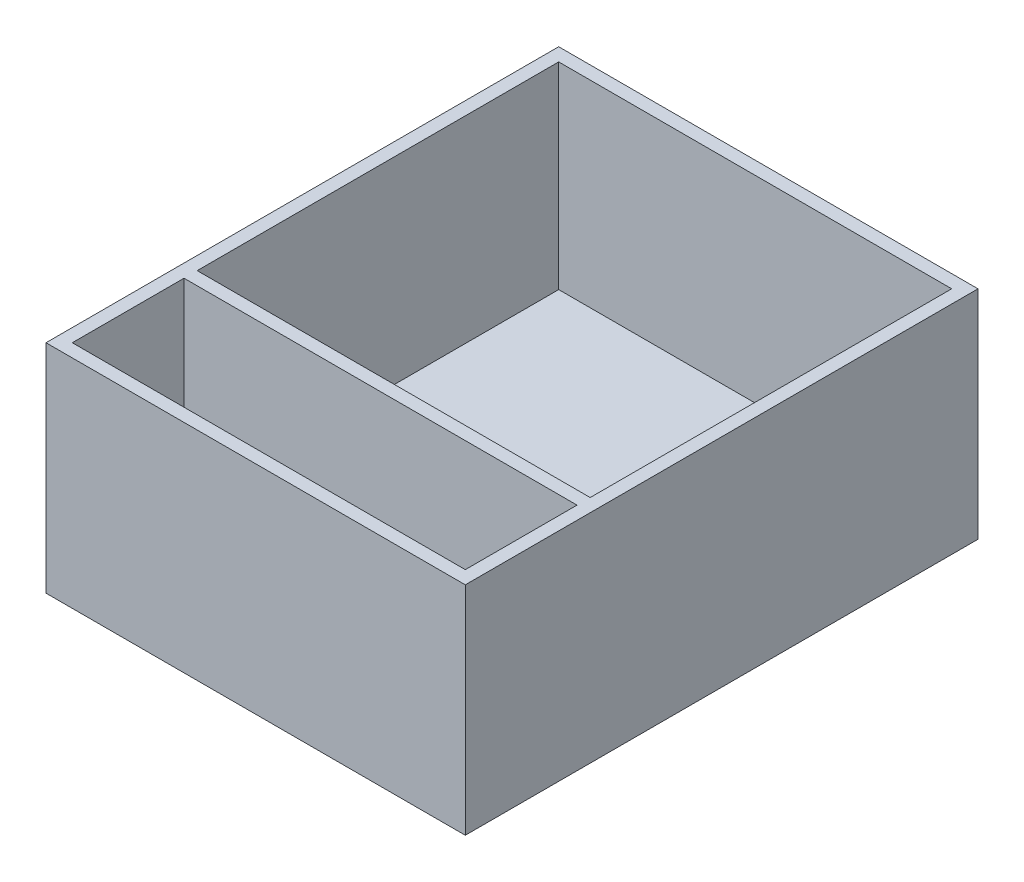
ISO-10303-21;
HEADER;
FILE_DESCRIPTION(('STEP AP214'),'2;1');
FILE_NAME('part.step','',(''),(''),'','','');
FILE_SCHEMA(('AUTOMOTIVE_DESIGN { 1 0 10303 214 1 1 1 1 }'));
ENDSEC;
DATA;
#1=APPLICATION_CONTEXT('core data for automotive mechanical design processes');
#2=APPLICATION_PROTOCOL_DEFINITION('international standard','automotive_design',2000,#1);
#3=PRODUCT_CONTEXT('',#1,'mechanical');
#4=PRODUCT('Part','Part','',(#3));
#5=PRODUCT_RELATED_PRODUCT_CATEGORY('part','',(#4));
#6=PRODUCT_DEFINITION_FORMATION('','',#4);
#7=PRODUCT_DEFINITION_CONTEXT('part definition',#1,'design');
#8=PRODUCT_DEFINITION('design','',#6,#7);
#9=PRODUCT_DEFINITION_SHAPE('','',#8);
#10=(LENGTH_UNIT() NAMED_UNIT(*) SI_UNIT(.MILLI.,.METRE.));
#11=(NAMED_UNIT(*) PLANE_ANGLE_UNIT() SI_UNIT($,.RADIAN.));
#12=(NAMED_UNIT(*) SI_UNIT($,.STERADIAN.) SOLID_ANGLE_UNIT());
#13=UNCERTAINTY_MEASURE_WITH_UNIT(LENGTH_MEASURE(1.E-05),#10,'distance_accuracy_value','');
#14=(GEOMETRIC_REPRESENTATION_CONTEXT(3) GLOBAL_UNCERTAINTY_ASSIGNED_CONTEXT((#13)) GLOBAL_UNIT_ASSIGNED_CONTEXT((#10,
#11,#12)) REPRESENTATION_CONTEXT('',''));
#15=CARTESIAN_POINT('',(0.,0.,0.));
#16=DIRECTION('',(0.,0.,1.));
#17=DIRECTION('',(1.,0.,0.));
#18=AXIS2_PLACEMENT_3D('',#15,#16,#17);
#19=CARTESIAN_POINT('',(0.,30.,52.7301638186687));
#20=DIRECTION('',(0.,0.,-1.));
#21=DIRECTION('',(-1.,0.,0.));
#22=AXIS2_PLACEMENT_3D('',#19,#20,#21);
#23=PLANE('',#22);
#24=DIRECTION('',(1.,0.,0.));
#25=VECTOR('',#24,1.);
#26=CARTESIAN_POINT('',(0.,0.,52.7301638186687));
#27=LINE('',#26,#25);
#28=CARTESIAN_POINT('',(-27.2157373250462,0.,52.7301638186687));
#29=VERTEX_POINT('',#28);
#30=CARTESIAN_POINT('',(32.5742626749538,0.,52.7301638186687));
#31=VERTEX_POINT('',#30);
#32=EDGE_CURVE('E150',#29,#31,#27,.T.);
#33=ORIENTED_EDGE('',*,*,#32,.T.);
#34=DIRECTION('',(0.,-1.,0.));
#35=VECTOR('',#34,1.);
#36=CARTESIAN_POINT('',(32.5742626749538,30.,52.7301638186687));
#37=LINE('',#36,#35);
#38=CARTESIAN_POINT('',(32.5742626749538,30.,52.7301638186687));
#39=VERTEX_POINT('',#38);
#40=EDGE_CURVE('E11',#39,#31,#37,.T.);
#41=ORIENTED_EDGE('',*,*,#40,.F.);
#42=DIRECTION('',(1.,0.,0.));
#43=VECTOR('',#42,1.);
#44=CARTESIAN_POINT('',(0.,30.,52.7301638186687));
#45=LINE('',#44,#43);
#46=CARTESIAN_POINT('',(-27.2157373250462,30.,52.7301638186687));
#47=VERTEX_POINT('',#46);
#48=EDGE_CURVE('E120',#47,#39,#45,.T.);
#49=ORIENTED_EDGE('',*,*,#48,.F.);
#50=DIRECTION('',(0.,-1.,0.));
#51=VECTOR('',#50,1.);
#52=CARTESIAN_POINT('',(-27.2157373250462,30.,52.7301638186687));
#53=LINE('',#52,#51);
#54=EDGE_CURVE('E52',#47,#29,#53,.T.);
#55=ORIENTED_EDGE('',*,*,#54,.T.);
#56=EDGE_LOOP('',(#33,#41,#49,#55));
#57=FACE_BOUND('',#56,.T.);
#58=ADVANCED_FACE('F33',(#57),#23,.F.);
#59=CARTESIAN_POINT('',(32.5742626749538,30.,0.));
#60=DIRECTION('',(1.,0.,0.));
#61=DIRECTION('',(0.,0.,-1.));
#62=AXIS2_PLACEMENT_3D('',#59,#60,#61);
#63=PLANE('',#62);
#64=DIRECTION('',(0.,0.,1.));
#65=VECTOR('',#64,1.);
#66=CARTESIAN_POINT('',(32.5742626749538,0.,0.));
#67=LINE('',#66,#65);
#68=CARTESIAN_POINT('',(32.5742626749538,0.,69.7301638186687));
#69=VERTEX_POINT('',#68);
#70=EDGE_CURVE('E126',#31,#69,#67,.T.);
#71=ORIENTED_EDGE('',*,*,#70,.T.);
#72=DIRECTION('',(0.,-1.,0.));
#73=VECTOR('',#72,1.);
#74=CARTESIAN_POINT('',(32.5742626749538,30.,69.7301638186687));
#75=LINE('',#74,#73);
#76=CARTESIAN_POINT('',(32.5742626749538,30.,69.7301638186687));
#77=VERTEX_POINT('',#76);
#78=EDGE_CURVE('E43',#77,#69,#75,.T.);
#79=ORIENTED_EDGE('',*,*,#78,.F.);
#80=DIRECTION('',(0.,0.,1.));
#81=VECTOR('',#80,1.);
#82=CARTESIAN_POINT('',(32.5742626749538,30.,0.));
#83=LINE('',#82,#81);
#84=EDGE_CURVE('E116',#39,#77,#83,.T.);
#85=ORIENTED_EDGE('',*,*,#84,.F.);
#86=ORIENTED_EDGE('',*,*,#40,.T.);
#87=EDGE_LOOP('',(#71,#79,#85,#86));
#88=FACE_BOUND('',#87,.T.);
#89=ADVANCED_FACE('F124',(#88),#63,.F.);
#90=CARTESIAN_POINT('',(0.,30.,69.7301638186687));
#91=DIRECTION('',(0.,0.,-1.));
#92=DIRECTION('',(-1.,0.,0.));
#93=AXIS2_PLACEMENT_3D('',#90,#91,#92);
#94=PLANE('',#93);
#95=DIRECTION('',(1.,0.,0.));
#96=VECTOR('',#95,1.);
#97=CARTESIAN_POINT('',(0.,0.,69.7301638186687));
#98=LINE('',#97,#96);
#99=CARTESIAN_POINT('',(-27.2157373250462,0.,69.7301638186687));
#100=VERTEX_POINT('',#99);
#101=EDGE_CURVE('E153',#100,#69,#98,.T.);
#102=ORIENTED_EDGE('',*,*,#101,.F.);
#103=DIRECTION('',(0.,-1.,0.));
#104=VECTOR('',#103,1.);
#105=CARTESIAN_POINT('',(-27.2157373250462,30.,69.7301638186687));
#106=LINE('',#105,#104);
#107=CARTESIAN_POINT('',(-27.2157373250462,30.,69.7301638186687));
#108=VERTEX_POINT('',#107);
#109=EDGE_CURVE('E128',#108,#100,#106,.T.);
#110=ORIENTED_EDGE('',*,*,#109,.F.);
#111=DIRECTION('',(1.,0.,0.));
#112=VECTOR('',#111,1.);
#113=CARTESIAN_POINT('',(0.,30.,69.7301638186687));
#114=LINE('',#113,#112);
#115=EDGE_CURVE('E119',#108,#77,#114,.T.);
#116=ORIENTED_EDGE('',*,*,#115,.T.);
#117=ORIENTED_EDGE('',*,*,#78,.T.);
#118=EDGE_LOOP('',(#102,#110,#116,#117));
#119=FACE_BOUND('',#118,.T.);
#120=ADVANCED_FACE('F130',(#119),#94,.T.);
#121=CARTESIAN_POINT('',(34.5742626749538,30.,0.));
#122=DIRECTION('',(1.,0.,0.));
#123=DIRECTION('',(0.,0.,-1.));
#124=AXIS2_PLACEMENT_3D('',#121,#122,#123);
#125=PLANE('',#124);
#126=DIRECTION('',(0.,-1.,0.));
#127=VECTOR('',#126,1.);
#128=CARTESIAN_POINT('',(34.5742626749538,30.,71.7301638186687));
#129=LINE('',#128,#127);
#130=CARTESIAN_POINT('',(34.5742626749538,30.,71.7301638186687));
#131=VERTEX_POINT('',#130);
#132=CARTESIAN_POINT('',(34.5742626749538,-3.,71.7301638186687));
#133=VERTEX_POINT('',#132);
#134=EDGE_CURVE('E162',#131,#133,#129,.T.);
#135=ORIENTED_EDGE('',*,*,#134,.T.);
#136=DIRECTION('',(0.,0.,1.));
#137=VECTOR('',#136,1.);
#138=CARTESIAN_POINT('',(34.5742626749538,-3.,-6.26983618133135));
#139=LINE('',#138,#137);
#140=CARTESIAN_POINT('',(34.5742626749538,-3.,-6.26983618133135));
#141=VERTEX_POINT('',#140);
#142=EDGE_CURVE('E230',#141,#133,#139,.T.);
#143=ORIENTED_EDGE('',*,*,#142,.F.);
#144=DIRECTION('',(0.,-1.,0.));
#145=VECTOR('',#144,1.);
#146=CARTESIAN_POINT('',(34.5742626749538,30.,-6.26983618133135));
#147=LINE('',#146,#145);
#148=CARTESIAN_POINT('',(34.5742626749538,30.,-6.26983618133135));
#149=VERTEX_POINT('',#148);
#150=EDGE_CURVE('E160',#149,#141,#147,.T.);
#151=ORIENTED_EDGE('',*,*,#150,.F.);
#152=DIRECTION('',(0.,0.,1.));
#153=VECTOR('',#152,1.);
#154=CARTESIAN_POINT('',(34.5742626749538,30.,0.));
#155=LINE('',#154,#153);
#156=EDGE_CURVE('E199',#149,#131,#155,.T.);
#157=ORIENTED_EDGE('',*,*,#156,.T.);
#158=EDGE_LOOP('',(#135,#143,#151,#157));
#159=FACE_BOUND('',#158,.T.);
#160=ADVANCED_FACE('F228',(#159),#125,.T.);
#161=CARTESIAN_POINT('',(0.,30.,-6.26983618133135));
#162=DIRECTION('',(0.,0.,-1.));
#163=DIRECTION('',(-1.,0.,0.));
#164=AXIS2_PLACEMENT_3D('',#161,#162,#163);
#165=PLANE('',#164);
#166=ORIENTED_EDGE('',*,*,#150,.T.);
#167=DIRECTION('',(1.,0.,0.));
#168=VECTOR('',#167,1.);
#169=CARTESIAN_POINT('',(-29.2157373250462,-3.,-6.26983618133135));
#170=LINE('',#169,#168);
#171=CARTESIAN_POINT('',(-29.2157373250462,-3.,-6.26983618133135));
#172=VERTEX_POINT('',#171);
#173=EDGE_CURVE('E236',#172,#141,#170,.T.);
#174=ORIENTED_EDGE('',*,*,#173,.F.);
#175=DIRECTION('',(0.,-1.,0.));
#176=VECTOR('',#175,1.);
#177=CARTESIAN_POINT('',(-29.2157373250462,30.,-6.26983618133135));
#178=LINE('',#177,#176);
#179=CARTESIAN_POINT('',(-29.2157373250462,30.,-6.26983618133135));
#180=VERTEX_POINT('',#179);
#181=EDGE_CURVE('E168',#180,#172,#178,.T.);
#182=ORIENTED_EDGE('',*,*,#181,.F.);
#183=DIRECTION('',(1.,0.,0.));
#184=VECTOR('',#183,1.);
#185=CARTESIAN_POINT('',(0.,30.,-6.26983618133135));
#186=LINE('',#185,#184);
#187=EDGE_CURVE('E203',#180,#149,#186,.T.);
#188=ORIENTED_EDGE('',*,*,#187,.T.);
#189=EDGE_LOOP('',(#166,#174,#182,#188));
#190=FACE_BOUND('',#189,.T.);
#191=ADVANCED_FACE('F234',(#190),#165,.T.);
#192=CARTESIAN_POINT('',(-29.2157373250462,30.,0.));
#193=DIRECTION('',(1.,0.,0.));
#194=DIRECTION('',(0.,0.,-1.));
#195=AXIS2_PLACEMENT_3D('',#192,#193,#194);
#196=PLANE('',#195);
#197=ORIENTED_EDGE('',*,*,#181,.T.);
#198=DIRECTION('',(0.,0.,-1.));
#199=VECTOR('',#198,1.);
#200=CARTESIAN_POINT('',(-29.2157373250462,-3.,-6.26983618133135));
#201=LINE('',#200,#199);
#202=CARTESIAN_POINT('',(-29.2157373250462,-3.,71.7301638186687));
#203=VERTEX_POINT('',#202);
#204=EDGE_CURVE('E242',#203,#172,#201,.T.);
#205=ORIENTED_EDGE('',*,*,#204,.F.);
#206=DIRECTION('',(0.,-1.,0.));
#207=VECTOR('',#206,1.);
#208=CARTESIAN_POINT('',(-29.2157373250462,30.,71.7301638186687));
#209=LINE('',#208,#207);
#210=CARTESIAN_POINT('',(-29.2157373250462,30.,71.7301638186687));
#211=VERTEX_POINT('',#210);
#212=EDGE_CURVE('E165',#211,#203,#209,.T.);
#213=ORIENTED_EDGE('',*,*,#212,.F.);
#214=DIRECTION('',(0.,0.,1.));
#215=VECTOR('',#214,1.);
#216=CARTESIAN_POINT('',(-29.2157373250462,30.,0.));
#217=LINE('',#216,#215);
#218=EDGE_CURVE('E210',#180,#211,#217,.T.);
#219=ORIENTED_EDGE('',*,*,#218,.F.);
#220=EDGE_LOOP('',(#197,#205,#213,#219));
#221=FACE_BOUND('',#220,.T.);
#222=ADVANCED_FACE('F269',(#221),#196,.F.);
#223=CARTESIAN_POINT('',(0.,30.,50.7301638186687));
#224=DIRECTION('',(0.,0.,-1.));
#225=DIRECTION('',(-1.,0.,0.));
#226=AXIS2_PLACEMENT_3D('',#223,#224,#225);
#227=PLANE('',#226);
#228=DIRECTION('',(1.,0.,0.));
#229=VECTOR('',#228,1.);
#230=CARTESIAN_POINT('',(0.,0.,50.7301638186687));
#231=LINE('',#230,#229);
#232=CARTESIAN_POINT('',(-27.2157373250462,0.,50.7301638186687));
#233=VERTEX_POINT('',#232);
#234=CARTESIAN_POINT('',(32.5742626749538,0.,50.7301638186687));
#235=VERTEX_POINT('',#234);
#236=EDGE_CURVE('E138',#233,#235,#231,.T.);
#237=ORIENTED_EDGE('',*,*,#236,.F.);
#238=DIRECTION('',(0.,-1.,0.));
#239=VECTOR('',#238,1.);
#240=CARTESIAN_POINT('',(-27.2157373250462,30.,50.7301638186687));
#241=LINE('',#240,#239);
#242=CARTESIAN_POINT('',(-27.2157373250462,30.,50.7301638186687));
#243=VERTEX_POINT('',#242);
#244=EDGE_CURVE('E37',#243,#233,#241,.T.);
#245=ORIENTED_EDGE('',*,*,#244,.F.);
#246=DIRECTION('',(1.,0.,0.));
#247=VECTOR('',#246,1.);
#248=CARTESIAN_POINT('',(0.,30.,50.7301638186687));
#249=LINE('',#248,#247);
#250=CARTESIAN_POINT('',(32.5742626749538,30.,50.7301638186687));
#251=VERTEX_POINT('',#250);
#252=EDGE_CURVE('E158',#243,#251,#249,.T.);
#253=ORIENTED_EDGE('',*,*,#252,.T.);
#254=DIRECTION('',(0.,-1.,0.));
#255=VECTOR('',#254,1.);
#256=CARTESIAN_POINT('',(32.5742626749538,30.,50.7301638186687));
#257=LINE('',#256,#255);
#258=EDGE_CURVE('E134',#251,#235,#257,.T.);
#259=ORIENTED_EDGE('',*,*,#258,.T.);
#260=EDGE_LOOP('',(#237,#245,#253,#259));
#261=FACE_BOUND('',#260,.T.);
#262=ADVANCED_FACE('F35',(#261),#227,.T.);
#263=CARTESIAN_POINT('',(-27.2157373250462,30.,0.));
#264=DIRECTION('',(-1.,0.,0.));
#265=DIRECTION('',(0.,0.,1.));
#266=AXIS2_PLACEMENT_3D('',#263,#264,#265);
#267=PLANE('',#266);
#268=DIRECTION('',(0.,0.,-1.));
#269=VECTOR('',#268,1.);
#270=CARTESIAN_POINT('',(-27.2157373250462,0.,0.));
#271=LINE('',#270,#269);
#272=CARTESIAN_POINT('',(-27.2157373250462,0.,-4.26983618133135));
#273=VERTEX_POINT('',#272);
#274=EDGE_CURVE('E141',#233,#273,#271,.T.);
#275=ORIENTED_EDGE('',*,*,#274,.T.);
#276=DIRECTION('',(0.,-1.,0.));
#277=VECTOR('',#276,1.);
#278=CARTESIAN_POINT('',(-27.2157373250462,30.,-4.26983618133135));
#279=LINE('',#278,#277);
#280=CARTESIAN_POINT('',(-27.2157373250462,30.,-4.26983618133135));
#281=VERTEX_POINT('',#280);
#282=EDGE_CURVE('E176',#281,#273,#279,.T.);
#283=ORIENTED_EDGE('',*,*,#282,.F.);
#284=DIRECTION('',(0.,0.,-1.));
#285=VECTOR('',#284,1.);
#286=CARTESIAN_POINT('',(-27.2157373250462,30.,0.));
#287=LINE('',#286,#285);
#288=EDGE_CURVE('E185',#243,#281,#287,.T.);
#289=ORIENTED_EDGE('',*,*,#288,.F.);
#290=ORIENTED_EDGE('',*,*,#244,.T.);
#291=EDGE_LOOP('',(#275,#283,#289,#290));
#292=FACE_BOUND('',#291,.T.);
#293=ADVANCED_FACE('F183',(#292),#267,.F.);
#294=CARTESIAN_POINT('',(0.,30.,-4.26983618133135));
#295=DIRECTION('',(0.,0.,-1.));
#296=DIRECTION('',(-1.,0.,0.));
#297=AXIS2_PLACEMENT_3D('',#294,#295,#296);
#298=PLANE('',#297);
#299=DIRECTION('',(1.,0.,0.));
#300=VECTOR('',#299,1.);
#301=CARTESIAN_POINT('',(0.,0.,-4.26983618133135));
#302=LINE('',#301,#300);
#303=CARTESIAN_POINT('',(32.5742626749538,0.,-4.26983618133135));
#304=VERTEX_POINT('',#303);
#305=EDGE_CURVE('E144',#273,#304,#302,.T.);
#306=ORIENTED_EDGE('',*,*,#305,.T.);
#307=DIRECTION('',(0.,-1.,0.));
#308=VECTOR('',#307,1.);
#309=CARTESIAN_POINT('',(32.5742626749538,30.,-4.26983618133135));
#310=LINE('',#309,#308);
#311=CARTESIAN_POINT('',(32.5742626749538,30.,-4.26983618133135));
#312=VERTEX_POINT('',#311);
#313=EDGE_CURVE('E174',#312,#304,#310,.T.);
#314=ORIENTED_EDGE('',*,*,#313,.F.);
#315=DIRECTION('',(1.,0.,0.));
#316=VECTOR('',#315,1.);
#317=CARTESIAN_POINT('',(0.,30.,-4.26983618133135));
#318=LINE('',#317,#316);
#319=EDGE_CURVE('E200',#281,#312,#318,.T.);
#320=ORIENTED_EDGE('',*,*,#319,.F.);
#321=ORIENTED_EDGE('',*,*,#282,.T.);
#322=EDGE_LOOP('',(#306,#314,#320,#321));
#323=FACE_BOUND('',#322,.T.);
#324=ADVANCED_FACE('F191',(#323),#298,.F.);
#325=CARTESIAN_POINT('',(0.,30.,71.7301638186687));
#326=DIRECTION('',(0.,0.,-1.));
#327=DIRECTION('',(-1.,0.,0.));
#328=AXIS2_PLACEMENT_3D('',#325,#326,#327);
#329=PLANE('',#328);
#330=ORIENTED_EDGE('',*,*,#212,.T.);
#331=DIRECTION('',(-1.,0.,0.));
#332=VECTOR('',#331,1.);
#333=CARTESIAN_POINT('',(-29.2157373250462,-3.,71.7301638186687));
#334=LINE('',#333,#332);
#335=EDGE_CURVE('E142',#133,#203,#334,.T.);
#336=ORIENTED_EDGE('',*,*,#335,.F.);
#337=ORIENTED_EDGE('',*,*,#134,.F.);
#338=DIRECTION('',(1.,0.,0.));
#339=VECTOR('',#338,1.);
#340=CARTESIAN_POINT('',(0.,30.,71.7301638186687));
#341=LINE('',#340,#339);
#342=EDGE_CURVE('E213',#211,#131,#341,.T.);
#343=ORIENTED_EDGE('',*,*,#342,.F.);
#344=EDGE_LOOP('',(#330,#336,#337,#343));
#345=FACE_BOUND('',#344,.T.);
#346=ADVANCED_FACE('F222',(#345),#329,.F.);
#347=CARTESIAN_POINT('',(32.5742626749538,30.,0.));
#348=DIRECTION('',(-1.,0.,0.));
#349=DIRECTION('',(0.,0.,1.));
#350=AXIS2_PLACEMENT_3D('',#347,#348,#349);
#351=PLANE('',#350);
#352=DIRECTION('',(0.,0.,-1.));
#353=VECTOR('',#352,1.);
#354=CARTESIAN_POINT('',(32.5742626749538,0.,0.));
#355=LINE('',#354,#353);
#356=EDGE_CURVE('E147',#235,#304,#355,.T.);
#357=ORIENTED_EDGE('',*,*,#356,.F.);
#358=ORIENTED_EDGE('',*,*,#258,.F.);
#359=DIRECTION('',(0.,0.,-1.));
#360=VECTOR('',#359,1.);
#361=CARTESIAN_POINT('',(32.5742626749538,30.,0.));
#362=LINE('',#361,#360);
#363=EDGE_CURVE('E197',#251,#312,#362,.T.);
#364=ORIENTED_EDGE('',*,*,#363,.T.);
#365=ORIENTED_EDGE('',*,*,#313,.T.);
#366=EDGE_LOOP('',(#357,#358,#364,#365));
#367=FACE_BOUND('',#366,.T.);
#368=ADVANCED_FACE('F195',(#367),#351,.T.);
#369=CARTESIAN_POINT('',(-27.2157373250462,30.,0.));
#370=DIRECTION('',(1.,0.,0.));
#371=DIRECTION('',(0.,0.,-1.));
#372=AXIS2_PLACEMENT_3D('',#369,#370,#371);
#373=PLANE('',#372);
#374=DIRECTION('',(0.,0.,1.));
#375=VECTOR('',#374,1.);
#376=CARTESIAN_POINT('',(-27.2157373250462,0.,0.));
#377=LINE('',#376,#375);
#378=EDGE_CURVE('E155',#29,#100,#377,.T.);
#379=ORIENTED_EDGE('',*,*,#378,.F.);
#380=ORIENTED_EDGE('',*,*,#54,.F.);
#381=DIRECTION('',(0.,0.,1.));
#382=VECTOR('',#381,1.);
#383=CARTESIAN_POINT('',(-27.2157373250462,30.,0.));
#384=LINE('',#383,#382);
#385=EDGE_CURVE('E132',#47,#108,#384,.T.);
#386=ORIENTED_EDGE('',*,*,#385,.T.);
#387=ORIENTED_EDGE('',*,*,#109,.T.);
#388=EDGE_LOOP('',(#379,#380,#386,#387));
#389=FACE_BOUND('',#388,.T.);
#390=ADVANCED_FACE('F249',(#389),#373,.T.);
#391=CARTESIAN_POINT('',(0.,30.,0.));
#392=DIRECTION('',(0.,1.,0.));
#393=DIRECTION('',(0.,0.,1.));
#394=AXIS2_PLACEMENT_3D('',#391,#392,#393);
#395=PLANE('',#394);
#396=ORIENTED_EDGE('',*,*,#252,.F.);
#397=ORIENTED_EDGE('',*,*,#288,.T.);
#398=ORIENTED_EDGE('',*,*,#319,.T.);
#399=ORIENTED_EDGE('',*,*,#363,.F.);
#400=EDGE_LOOP('',(#396,#397,#398,#399));
#401=FACE_BOUND('',#400,.T.);
#402=ORIENTED_EDGE('',*,*,#156,.F.);
#403=ORIENTED_EDGE('',*,*,#187,.F.);
#404=ORIENTED_EDGE('',*,*,#218,.T.);
#405=ORIENTED_EDGE('',*,*,#342,.T.);
#406=EDGE_LOOP('',(#402,#403,#404,#405));
#407=FACE_BOUND('',#406,.T.);
#408=ORIENTED_EDGE('',*,*,#48,.T.);
#409=ORIENTED_EDGE('',*,*,#84,.T.);
#410=ORIENTED_EDGE('',*,*,#115,.F.);
#411=ORIENTED_EDGE('',*,*,#385,.F.);
#412=EDGE_LOOP('',(#408,#409,#410,#411));
#413=FACE_BOUND('',#412,.T.);
#414=ADVANCED_FACE('F117',(#401,#407,#413),#395,.T.);
#415=CARTESIAN_POINT('',(0.,-3.,0.));
#416=DIRECTION('',(0.,1.,0.));
#417=DIRECTION('',(0.,0.,1.));
#418=AXIS2_PLACEMENT_3D('',#415,#416,#417);
#419=PLANE('',#418);
#420=ORIENTED_EDGE('',*,*,#204,.T.);
#421=ORIENTED_EDGE('',*,*,#173,.T.);
#422=ORIENTED_EDGE('',*,*,#142,.T.);
#423=ORIENTED_EDGE('',*,*,#335,.T.);
#424=EDGE_LOOP('',(#420,#421,#422,#423));
#425=FACE_BOUND('',#424,.T.);
#426=ADVANCED_FACE('F240',(#425),#419,.F.);
#427=CARTESIAN_POINT('',(0.,0.,0.));
#428=DIRECTION('',(0.,1.,0.));
#429=DIRECTION('',(0.,0.,1.));
#430=AXIS2_PLACEMENT_3D('',#427,#428,#429);
#431=PLANE('',#430);
#432=ORIENTED_EDGE('',*,*,#32,.F.);
#433=ORIENTED_EDGE('',*,*,#378,.T.);
#434=ORIENTED_EDGE('',*,*,#101,.T.);
#435=ORIENTED_EDGE('',*,*,#70,.F.);
#436=EDGE_LOOP('',(#432,#433,#434,#435));
#437=FACE_BOUND('',#436,.T.);
#438=ADVANCED_FACE('F255',(#437),#431,.T.);
#439=ORIENTED_EDGE('',*,*,#274,.F.);
#440=ORIENTED_EDGE('',*,*,#236,.T.);
#441=ORIENTED_EDGE('',*,*,#356,.T.);
#442=ORIENTED_EDGE('',*,*,#305,.F.);
#443=EDGE_LOOP('',(#439,#440,#441,#442));
#444=FACE_BOUND('',#443,.T.);
#445=ADVANCED_FACE('F189',(#444),#431,.T.);
#446=CLOSED_SHELL('',(#58,#89,#120,#160,#191,#222,#262,#293,#324,#346,#368,#390,#414,#426,#438,#445));
#447=MANIFOLD_SOLID_BREP('B2',#446);
#448=ADVANCED_BREP_SHAPE_REPRESENTATION('',(#18,#447),#14);
#449=SHAPE_DEFINITION_REPRESENTATION(#9,#448);
ENDSEC;
END-ISO-10303-21;
